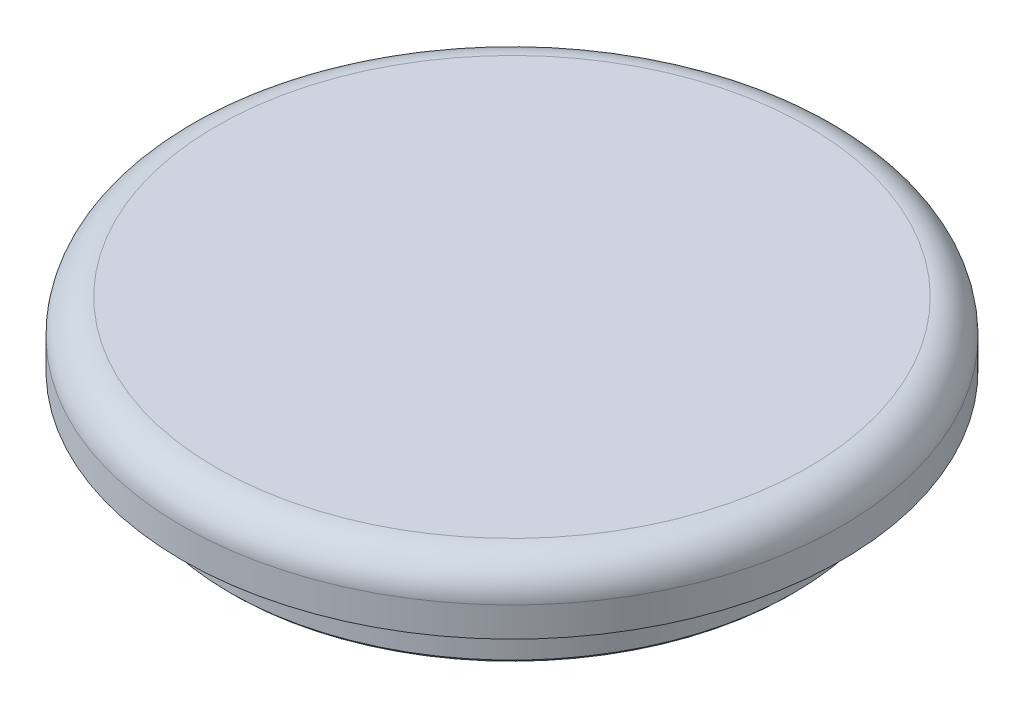
ISO-10303-21;
HEADER;
FILE_DESCRIPTION(('STEP AP214'),'2;1');
FILE_NAME('part.step','',(''),(''),'','','');
FILE_SCHEMA(('AUTOMOTIVE_DESIGN { 1 0 10303 214 1 1 1 1 }'));
ENDSEC;
DATA;
#1=APPLICATION_CONTEXT('core data for automotive mechanical design processes');
#2=APPLICATION_PROTOCOL_DEFINITION('international standard','automotive_design',2000,#1);
#3=PRODUCT_CONTEXT('',#1,'mechanical');
#4=PRODUCT('Part','Part','',(#3));
#5=PRODUCT_RELATED_PRODUCT_CATEGORY('part','',(#4));
#6=PRODUCT_DEFINITION_FORMATION('','',#4);
#7=PRODUCT_DEFINITION_CONTEXT('part definition',#1,'design');
#8=PRODUCT_DEFINITION('design','',#6,#7);
#9=PRODUCT_DEFINITION_SHAPE('','',#8);
#10=(LENGTH_UNIT() NAMED_UNIT(*) SI_UNIT(.MILLI.,.METRE.));
#11=(NAMED_UNIT(*) PLANE_ANGLE_UNIT() SI_UNIT($,.RADIAN.));
#12=(NAMED_UNIT(*) SI_UNIT($,.STERADIAN.) SOLID_ANGLE_UNIT());
#13=UNCERTAINTY_MEASURE_WITH_UNIT(LENGTH_MEASURE(1.E-05),#10,'distance_accuracy_value','');
#14=(GEOMETRIC_REPRESENTATION_CONTEXT(3) GLOBAL_UNCERTAINTY_ASSIGNED_CONTEXT((#13)) GLOBAL_UNIT_ASSIGNED_CONTEXT((#10,
#11,#12)) REPRESENTATION_CONTEXT('',''));
#15=CARTESIAN_POINT('',(0.,0.,0.));
#16=DIRECTION('',(0.,0.,1.));
#17=DIRECTION('',(1.,0.,0.));
#18=AXIS2_PLACEMENT_3D('',#15,#16,#17);
#19=CARTESIAN_POINT('',(0.,9.525,0.));
#20=DIRECTION('',(0.,-1.,0.));
#21=DIRECTION('',(0.,0.,-1.));
#22=AXIS2_PLACEMENT_3D('',#19,#20,#21);
#23=CYLINDRICAL_SURFACE('',#22,49.53);
#24=CARTESIAN_POINT('',(0.,4.445,0.));
#25=DIRECTION('',(0.,1.,0.));
#26=DIRECTION('',(0.,0.,1.));
#27=AXIS2_PLACEMENT_3D('',#24,#25,#26);
#28=CIRCLE('',#27,49.53);
#29=CARTESIAN_POINT('',(0.,4.445,-49.53));
#30=VERTEX_POINT('',#29);
#31=EDGE_CURVE('E70',#30,#30,#28,.F.);
#32=CARTESIAN_POINT('',(0.,0.,0.));
#33=DIRECTION('',(0.,1.,0.));
#34=DIRECTION('',(0.,0.,1.));
#35=AXIS2_PLACEMENT_3D('',#32,#33,#34);
#36=CIRCLE('',#35,49.53);
#37=CARTESIAN_POINT('',(0.,0.,-49.53));
#38=VERTEX_POINT('',#37);
#39=EDGE_CURVE('E82',#38,#38,#36,.T.);
#40=CARTESIAN_POINT('',(0.,4.445,-49.53));
#41=CARTESIAN_POINT('',(0.,4.39869791666667,-49.53));
#42=CARTESIAN_POINT('',(0.,4.35239583333333,-49.53));
#43=CARTESIAN_POINT('',(0.,4.25979166666667,-49.53));
#44=CARTESIAN_POINT('',(0.,4.21348958333333,-49.53));
#45=CARTESIAN_POINT('',(0.,4.12088541666667,-49.53));
#46=CARTESIAN_POINT('',(0.,4.07458333333333,-49.53));
#47=CARTESIAN_POINT('',(0.,3.98197916666667,-49.53));
#48=CARTESIAN_POINT('',(0.,3.93567708333333,-49.53));
#49=CARTESIAN_POINT('',(0.,3.84307291666667,-49.53));
#50=CARTESIAN_POINT('',(0.,3.79677083333333,-49.53));
#51=CARTESIAN_POINT('',(0.,3.70416666666667,-49.53));
#52=CARTESIAN_POINT('',(0.,3.65786458333333,-49.53));
#53=CARTESIAN_POINT('',(0.,3.56526041666667,-49.53));
#54=CARTESIAN_POINT('',(0.,3.51895833333333,-49.53));
#55=CARTESIAN_POINT('',(0.,3.42635416666667,-49.53));
#56=CARTESIAN_POINT('',(0.,3.38005208333333,-49.53));
#57=CARTESIAN_POINT('',(0.,3.28744791666667,-49.53));
#58=CARTESIAN_POINT('',(0.,3.24114583333333,-49.53));
#59=CARTESIAN_POINT('',(0.,3.14854166666667,-49.53));
#60=CARTESIAN_POINT('',(0.,3.10223958333333,-49.53));
#61=CARTESIAN_POINT('',(0.,3.00963541666667,-49.53));
#62=CARTESIAN_POINT('',(0.,2.96333333333333,-49.53));
#63=CARTESIAN_POINT('',(0.,2.87072916666667,-49.53));
#64=CARTESIAN_POINT('',(0.,2.82442708333333,-49.53));
#65=CARTESIAN_POINT('',(0.,2.73182291666667,-49.53));
#66=CARTESIAN_POINT('',(0.,2.68552083333333,-49.53));
#67=CARTESIAN_POINT('',(0.,2.59291666666667,-49.53));
#68=CARTESIAN_POINT('',(0.,2.54661458333333,-49.53));
#69=CARTESIAN_POINT('',(0.,2.45401041666667,-49.53));
#70=CARTESIAN_POINT('',(0.,2.40770833333333,-49.53));
#71=CARTESIAN_POINT('',(0.,2.31510416666667,-49.53));
#72=CARTESIAN_POINT('',(0.,2.26880208333333,-49.53));
#73=CARTESIAN_POINT('',(0.,2.17619791666667,-49.53));
#74=CARTESIAN_POINT('',(0.,2.12989583333333,-49.53));
#75=CARTESIAN_POINT('',(0.,2.03729166666667,-49.53));
#76=CARTESIAN_POINT('',(0.,1.99098958333333,-49.53));
#77=CARTESIAN_POINT('',(0.,1.89838541666667,-49.53));
#78=CARTESIAN_POINT('',(0.,1.85208333333333,-49.53));
#79=CARTESIAN_POINT('',(0.,1.75947916666667,-49.53));
#80=CARTESIAN_POINT('',(0.,1.71317708333333,-49.53));
#81=CARTESIAN_POINT('',(0.,1.62057291666667,-49.53));
#82=CARTESIAN_POINT('',(0.,1.57427083333333,-49.53));
#83=CARTESIAN_POINT('',(0.,1.48166666666667,-49.53));
#84=CARTESIAN_POINT('',(0.,1.43536458333333,-49.53));
#85=CARTESIAN_POINT('',(0.,1.34276041666667,-49.53));
#86=CARTESIAN_POINT('',(0.,1.29645833333333,-49.53));
#87=CARTESIAN_POINT('',(0.,1.20385416666667,-49.53));
#88=CARTESIAN_POINT('',(0.,1.15755208333333,-49.53));
#89=CARTESIAN_POINT('',(0.,1.06494791666667,-49.53));
#90=CARTESIAN_POINT('',(0.,1.01864583333333,-49.53));
#91=CARTESIAN_POINT('',(0.,0.926041666666666,-49.53));
#92=CARTESIAN_POINT('',(0.,0.879739583333333,-49.53));
#93=CARTESIAN_POINT('',(0.,0.787135416666666,-49.53));
#94=CARTESIAN_POINT('',(0.,0.740833333333333,-49.53));
#95=CARTESIAN_POINT('',(0.,0.648229166666667,-49.53));
#96=CARTESIAN_POINT('',(0.,0.601927083333334,-49.53));
#97=CARTESIAN_POINT('',(0.,0.509322916666667,-49.53));
#98=CARTESIAN_POINT('',(0.,0.463020833333333,-49.53));
#99=CARTESIAN_POINT('',(0.,0.370416666666666,-49.53));
#100=CARTESIAN_POINT('',(0.,0.324114583333333,-49.53));
#101=CARTESIAN_POINT('',(0.,0.231510416666667,-49.53));
#102=CARTESIAN_POINT('',(0.,0.185208333333334,-49.53));
#103=CARTESIAN_POINT('',(0.,0.0926041666666673,-49.53));
#104=CARTESIAN_POINT('',(0.,0.0463020833333337,-49.53));
#105=CARTESIAN_POINT('',(0.,0.,-49.53));
#106=B_SPLINE_CURVE_WITH_KNOTS('',3,(#40,#41,#42,#43,#44,#45,#46,#47,#48,#49,#50,#51,#52,#53,
#54,#55,#56,#57,#58,#59,#60,#61,#62,#63,#64,#65,#66,#67,#68,#69,#70,#71,#72,#73,#74,#75,#76,#77,
#78,#79,#80,#81,#82,#83,#84,#85,#86,#87,#88,#89,#90,#91,#92,#93,#94,#95,#96,#97,#98,#99,#100,
#101,#102,#103,#104,#105),.UNSPECIFIED.,.F.,.F.,(4,2,2,2,2,2,2,2,2,2,2,2,2,2,2,2,2,2,2,2,2,2,2,
2,2,2,2,2,2,2,2,2,4),(0.,0.13890625,0.2778125,0.41671875,0.555625000000001,0.69453125,0.8334375,
0.97234375,1.11125,1.25015625,1.3890625,1.52796875,1.666875,1.80578125,1.9446875,2.08359375,
2.2225,2.36140625,2.5003125,2.63921875,2.778125,2.91703125,3.0559375,3.19484375,3.33375,
3.47265625,3.6115625,3.75046875,3.889375,4.02828125,4.1671875,4.30609375,4.445),.UNSPECIFIED.);
#107=EDGE_CURVE('BSEAM45',#30,#38,#106,.T.);
#108=ORIENTED_EDGE('',*,*,#31,.T.);
#109=ORIENTED_EDGE('',*,*,#39,.T.);
#110=ORIENTED_EDGE('',*,*,#107,.T.);
#111=ORIENTED_EDGE('',*,*,#107,.F.);
#112=EDGE_LOOP('',(#108,#110,#109,#111));
#113=FACE_BOUND('',#112,.T.);
#114=ADVANCED_FACE('F45',(#113),#23,.T.);
#115=CARTESIAN_POINT('',(0.,9.525,0.));
#116=DIRECTION('',(0.,1.,0.));
#117=DIRECTION('',(0.,0.,1.));
#118=AXIS2_PLACEMENT_3D('',#115,#116,#117);
#119=PLANE('',#118);
#120=CARTESIAN_POINT('',(0.,9.525,0.));
#121=DIRECTION('',(0.,1.,0.));
#122=DIRECTION('',(0.,0.,1.));
#123=AXIS2_PLACEMENT_3D('',#120,#121,#122);
#124=CIRCLE('',#123,44.45);
#125=CARTESIAN_POINT('',(0.,9.525,44.45));
#126=VERTEX_POINT('',#125);
#127=EDGE_CURVE('E74',#126,#126,#124,.T.);
#128=ORIENTED_EDGE('',*,*,#127,.T.);
#129=EDGE_LOOP('',(#128));
#130=FACE_BOUND('',#129,.T.);
#131=ADVANCED_FACE('F110',(#130),#119,.T.);
#132=CARTESIAN_POINT('',(0.,0.,0.));
#133=DIRECTION('',(0.,1.,0.));
#134=DIRECTION('',(0.,0.,1.));
#135=AXIS2_PLACEMENT_3D('',#132,#133,#134);
#136=PLANE('',#135);
#137=CARTESIAN_POINT('',(0.,0.,0.));
#138=DIRECTION('',(0.,1.,0.));
#139=DIRECTION('',(0.,0.,1.));
#140=AXIS2_PLACEMENT_3D('',#137,#138,#139);
#141=CIRCLE('',#140,42.4265266010759);
#142=CARTESIAN_POINT('',(0.,0.,42.4265266010759));
#143=VERTEX_POINT('',#142);
#144=EDGE_CURVE('E78',#143,#143,#141,.F.);
#145=ORIENTED_EDGE('',*,*,#144,.F.);
#146=EDGE_LOOP('',(#145));
#147=FACE_BOUND('',#146,.T.);
#148=ORIENTED_EDGE('',*,*,#39,.F.);
#149=EDGE_LOOP('',(#148));
#150=FACE_BOUND('',#149,.T.);
#151=ADVANCED_FACE('F105',(#147,#150),#136,.F.);
#152=CARTESIAN_POINT('',(0.,-8.255,0.));
#153=DIRECTION('',(0.,-1.,0.));
#154=DIRECTION('',(0.,0.,-1.));
#155=AXIS2_PLACEMENT_3D('',#152,#153,#154);
#156=PLANE('',#155);
#157=CARTESIAN_POINT('',(0.,-8.255,0.));
#158=DIRECTION('',(0.,-1.,0.));
#159=DIRECTION('',(0.,0.,-1.));
#160=AXIS2_PLACEMENT_3D('',#157,#158,#159);
#161=CIRCLE('',#160,36.5845266010759);
#162=CARTESIAN_POINT('',(0.,-8.255,-36.5845266010759));
#163=VERTEX_POINT('',#162);
#164=EDGE_CURVE('E54',#163,#163,#161,.F.);
#165=ORIENTED_EDGE('',*,*,#164,.T.);
#166=EDGE_LOOP('',(#165));
#167=FACE_BOUND('',#166,.T.);
#168=CARTESIAN_POINT('',(0.,-8.255,0.));
#169=DIRECTION('',(0.,-1.,0.));
#170=DIRECTION('',(0.,0.,-1.));
#171=AXIS2_PLACEMENT_3D('',#168,#169,#170);
#172=CIRCLE('',#171,41.9185266010759);
#173=CARTESIAN_POINT('',(0.,-8.255,-41.9185266010759));
#174=VERTEX_POINT('',#173);
#175=EDGE_CURVE('E59',#174,#174,#172,.T.);
#176=ORIENTED_EDGE('',*,*,#175,.T.);
#177=EDGE_LOOP('',(#176));
#178=FACE_BOUND('',#177,.T.);
#179=ADVANCED_FACE('F106',(#167,#178),#156,.T.);
#180=CARTESIAN_POINT('',(0.,-8.255,0.));
#181=DIRECTION('',(0.,1.,0.));
#182=DIRECTION('',(0.,0.,1.));
#183=AXIS2_PLACEMENT_3D('',#180,#181,#182);
#184=CYLINDRICAL_SURFACE('',#183,42.4265266010759);
#185=CARTESIAN_POINT('',(0.,-7.74700000000001,0.));
#186=DIRECTION('',(0.,-1.,0.));
#187=DIRECTION('',(0.,0.,-1.));
#188=AXIS2_PLACEMENT_3D('',#185,#186,#187);
#189=CIRCLE('',#188,42.4265266010759);
#190=CARTESIAN_POINT('',(0.,-7.74700000000001,-42.4265266010759));
#191=VERTEX_POINT('',#190);
#192=EDGE_CURVE('E10',#191,#191,#189,.F.);
#193=ORIENTED_EDGE('',*,*,#192,.T.);
#194=EDGE_LOOP('',(#193));
#195=FACE_BOUND('',#194,.T.);
#196=ORIENTED_EDGE('',*,*,#144,.T.);
#197=EDGE_LOOP('',(#196));
#198=FACE_BOUND('',#197,.T.);
#199=ADVANCED_FACE('F95',(#195,#198),#184,.T.);
#200=CARTESIAN_POINT('',(0.,-8.255,0.));
#201=DIRECTION('',(0.,1.,0.));
#202=DIRECTION('',(0.,0.,1.));
#203=AXIS2_PLACEMENT_3D('',#200,#201,#202);
#204=CYLINDRICAL_SURFACE('',#203,36.0765266010759);
#205=CARTESIAN_POINT('',(0.,-7.74699999999999,0.));
#206=DIRECTION('',(0.,-1.,0.));
#207=DIRECTION('',(0.,0.,-1.));
#208=AXIS2_PLACEMENT_3D('',#205,#206,#207);
#209=CIRCLE('',#208,36.0765266010759);
#210=CARTESIAN_POINT('',(0.,-7.74699999999999,-36.0765266010759));
#211=VERTEX_POINT('',#210);
#212=EDGE_CURVE('E64',#211,#211,#209,.T.);
#213=ORIENTED_EDGE('',*,*,#212,.T.);
#214=EDGE_LOOP('',(#213));
#215=FACE_BOUND('',#214,.T.);
#216=CARTESIAN_POINT('',(0.,0.,0.));
#217=DIRECTION('',(0.,-1.,0.));
#218=DIRECTION('',(0.,0.,-1.));
#219=AXIS2_PLACEMENT_3D('',#216,#217,#218);
#220=CIRCLE('',#219,36.0765266010759);
#221=CARTESIAN_POINT('',(0.,0.,-36.0765266010759));
#222=VERTEX_POINT('',#221);
#223=EDGE_CURVE('E86',#222,#222,#220,.T.);
#224=ORIENTED_EDGE('',*,*,#223,.F.);
#225=EDGE_LOOP('',(#224));
#226=FACE_BOUND('',#225,.T.);
#227=ADVANCED_FACE('F93',(#215,#226),#204,.F.);
#228=ORIENTED_EDGE('',*,*,#223,.T.);
#229=EDGE_LOOP('',(#228));
#230=FACE_BOUND('',#229,.T.);
#231=ADVANCED_FACE('F91',(#230),#136,.F.);
#232=CARTESIAN_POINT('',(0.,4.445,0.));
#233=DIRECTION('',(0.,1.,0.));
#234=DIRECTION('',(0.,0.,1.));
#235=AXIS2_PLACEMENT_3D('',#232,#233,#234);
#236=TOROIDAL_SURFACE('',#235,44.45,5.08);
#237=ORIENTED_EDGE('',*,*,#31,.F.);
#238=EDGE_LOOP('',(#237));
#239=FACE_BOUND('',#238,.T.);
#240=ORIENTED_EDGE('',*,*,#127,.F.);
#241=EDGE_LOOP('',(#240));
#242=FACE_BOUND('',#241,.T.);
#243=ADVANCED_FACE('F103',(#239,#242),#236,.T.);
#244=CARTESIAN_POINT('',(0.,-7.74699999999999,0.));
#245=DIRECTION('',(0.,-1.,0.));
#246=DIRECTION('',(0.,0.,-1.));
#247=AXIS2_PLACEMENT_3D('',#244,#245,#246);
#248=CONICAL_SURFACE('',#247,36.0765266010759,0.785398163397448);
#249=ORIENTED_EDGE('',*,*,#164,.F.);
#250=EDGE_LOOP('',(#249));
#251=FACE_BOUND('',#250,.T.);
#252=ORIENTED_EDGE('',*,*,#212,.F.);
#253=EDGE_LOOP('',(#252));
#254=FACE_BOUND('',#253,.T.);
#255=ADVANCED_FACE('F121',(#251,#254),#248,.F.);
#256=CARTESIAN_POINT('',(0.,-8.255,0.));
#257=DIRECTION('',(0.,1.,0.));
#258=DIRECTION('',(0.,0.,1.));
#259=AXIS2_PLACEMENT_3D('',#256,#257,#258);
#260=CONICAL_SURFACE('',#259,41.9185266010759,0.785398163397442);
#261=ORIENTED_EDGE('',*,*,#192,.F.);
#262=EDGE_LOOP('',(#261));
#263=FACE_BOUND('',#262,.T.);
#264=ORIENTED_EDGE('',*,*,#175,.F.);
#265=EDGE_LOOP('',(#264));
#266=FACE_BOUND('',#265,.T.);
#267=ADVANCED_FACE('F48',(#263,#266),#260,.T.);
#268=CLOSED_SHELL('',(#114,#131,#151,#179,#199,#227,#231,#243,#255,#267));
#269=MANIFOLD_SOLID_BREP('B2',#268);
#270=ADVANCED_BREP_SHAPE_REPRESENTATION('',(#18,#269),#14);
#271=SHAPE_DEFINITION_REPRESENTATION(#9,#270);
ENDSEC;
END-ISO-10303-21;
